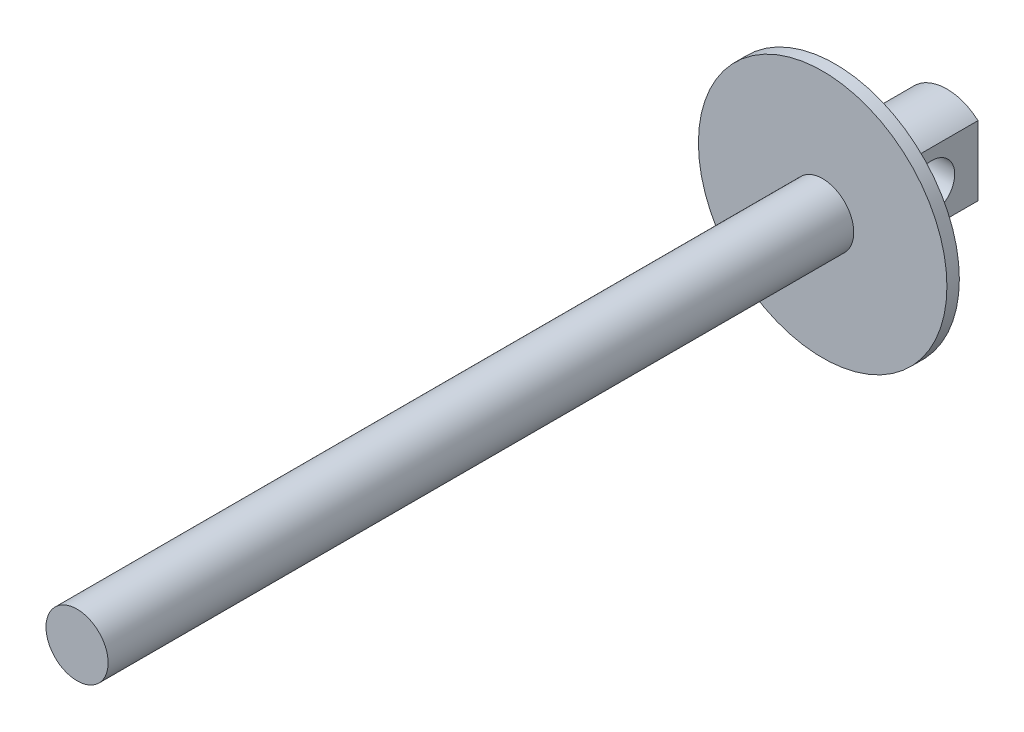
ISO-10303-21;
HEADER;
FILE_DESCRIPTION(('STEP AP214'),'2;1');
FILE_NAME('part.step','',(''),(''),'','','');
FILE_SCHEMA(('AUTOMOTIVE_DESIGN { 1 0 10303 214 1 1 1 1 }'));
ENDSEC;
DATA;
#1=APPLICATION_CONTEXT('core data for automotive mechanical design processes');
#2=APPLICATION_PROTOCOL_DEFINITION('international standard','automotive_design',2000,#1);
#3=PRODUCT_CONTEXT('',#1,'mechanical');
#4=PRODUCT('Part','Part','',(#3));
#5=PRODUCT_RELATED_PRODUCT_CATEGORY('part','',(#4));
#6=PRODUCT_DEFINITION_FORMATION('','',#4);
#7=PRODUCT_DEFINITION_CONTEXT('part definition',#1,'design');
#8=PRODUCT_DEFINITION('design','',#6,#7);
#9=PRODUCT_DEFINITION_SHAPE('','',#8);
#10=(LENGTH_UNIT() NAMED_UNIT(*) SI_UNIT(.MILLI.,.METRE.));
#11=(NAMED_UNIT(*) PLANE_ANGLE_UNIT() SI_UNIT($,.RADIAN.));
#12=(NAMED_UNIT(*) SI_UNIT($,.STERADIAN.) SOLID_ANGLE_UNIT());
#13=UNCERTAINTY_MEASURE_WITH_UNIT(LENGTH_MEASURE(1.E-05),#10,'distance_accuracy_value','');
#14=(GEOMETRIC_REPRESENTATION_CONTEXT(3) GLOBAL_UNCERTAINTY_ASSIGNED_CONTEXT((#13)) GLOBAL_UNIT_ASSIGNED_CONTEXT((#10,
#11,#12)) REPRESENTATION_CONTEXT('',''));
#15=CARTESIAN_POINT('',(0.,0.,0.));
#16=DIRECTION('',(0.,0.,1.));
#17=DIRECTION('',(1.,0.,0.));
#18=AXIS2_PLACEMENT_3D('',#15,#16,#17);
#19=CARTESIAN_POINT('',(0.,0.,2.54));
#20=DIRECTION('',(0.,0.,-1.));
#21=DIRECTION('',(-1.,0.,0.));
#22=AXIS2_PLACEMENT_3D('',#19,#20,#21);
#23=CYLINDRICAL_SURFACE('',#22,25.4);
#24=CARTESIAN_POINT('',(0.,0.,2.54));
#25=DIRECTION('',(0.,0.,1.));
#26=DIRECTION('',(1.,0.,0.));
#27=AXIS2_PLACEMENT_3D('',#24,#25,#26);
#28=CIRCLE('',#27,25.4);
#29=CARTESIAN_POINT('',(25.4,0.,2.54));
#30=VERTEX_POINT('',#29);
#31=EDGE_CURVE('E113',#30,#30,#28,.T.);
#32=ORIENTED_EDGE('',*,*,#31,.F.);
#33=EDGE_LOOP('',(#32));
#34=FACE_BOUND('',#33,.T.);
#35=CARTESIAN_POINT('',(0.,0.,0.));
#36=DIRECTION('',(0.,0.,1.));
#37=DIRECTION('',(1.,0.,0.));
#38=AXIS2_PLACEMENT_3D('',#35,#36,#37);
#39=CIRCLE('',#38,25.4);
#40=CARTESIAN_POINT('',(25.4,0.,0.));
#41=VERTEX_POINT('',#40);
#42=EDGE_CURVE('E110',#41,#41,#39,.T.);
#43=ORIENTED_EDGE('',*,*,#42,.T.);
#44=EDGE_LOOP('',(#43));
#45=FACE_BOUND('',#44,.T.);
#46=ADVANCED_FACE('F37',(#34,#45),#23,.T.);
#47=CARTESIAN_POINT('',(0.,0.,2.54));
#48=DIRECTION('',(0.,0.,1.));
#49=DIRECTION('',(1.,0.,0.));
#50=AXIS2_PLACEMENT_3D('',#47,#48,#49);
#51=PLANE('',#50);
#52=CARTESIAN_POINT('',(0.,0.,2.54));
#53=DIRECTION('',(0.,0.,1.));
#54=DIRECTION('',(1.,0.,0.));
#55=AXIS2_PLACEMENT_3D('',#52,#53,#54);
#56=CIRCLE('',#55,6.35);
#57=CARTESIAN_POINT('',(-6.35,0.,2.53999999999999));
#58=VERTEX_POINT('',#57);
#59=EDGE_CURVE('E107',#58,#58,#56,.T.);
#60=ORIENTED_EDGE('',*,*,#59,.F.);
#61=EDGE_LOOP('',(#60));
#62=FACE_BOUND('',#61,.T.);
#63=ORIENTED_EDGE('',*,*,#31,.T.);
#64=EDGE_LOOP('',(#63));
#65=FACE_BOUND('',#64,.T.);
#66=ADVANCED_FACE('F145',(#62,#65),#51,.T.);
#67=CARTESIAN_POINT('',(0.,0.,0.));
#68=DIRECTION('',(0.,0.,1.));
#69=DIRECTION('',(1.,0.,0.));
#70=AXIS2_PLACEMENT_3D('',#67,#68,#69);
#71=PLANE('',#70);
#72=CARTESIAN_POINT('',(0.,0.,0.));
#73=DIRECTION('',(0.,0.,-1.));
#74=DIRECTION('',(-1.,0.,0.));
#75=AXIS2_PLACEMENT_3D('',#72,#73,#74);
#76=CIRCLE('',#75,9.525);
#77=CARTESIAN_POINT('',(-9.525,0.,0.));
#78=VERTEX_POINT('',#77);
#79=EDGE_CURVE('E87',#78,#78,#76,.T.);
#80=ORIENTED_EDGE('',*,*,#79,.F.);
#81=EDGE_LOOP('',(#80));
#82=FACE_BOUND('',#81,.T.);
#83=ORIENTED_EDGE('',*,*,#42,.F.);
#84=EDGE_LOOP('',(#83));
#85=FACE_BOUND('',#84,.T.);
#86=ADVANCED_FACE('F150',(#82,#85),#71,.F.);
#87=CARTESIAN_POINT('',(0.,0.,154.94));
#88=DIRECTION('',(0.,0.,-1.));
#89=DIRECTION('',(-1.,0.,0.));
#90=AXIS2_PLACEMENT_3D('',#87,#88,#89);
#91=CYLINDRICAL_SURFACE('',#90,6.35);
#92=CARTESIAN_POINT('',(0.,0.,154.94));
#93=DIRECTION('',(0.,0.,1.));
#94=DIRECTION('',(1.,0.,0.));
#95=AXIS2_PLACEMENT_3D('',#92,#93,#94);
#96=CIRCLE('',#95,6.35);
#97=CARTESIAN_POINT('',(-6.35,0.,154.94));
#98=VERTEX_POINT('',#97);
#99=EDGE_CURVE('E100',#98,#98,#96,.T.);
#100=CARTESIAN_POINT('',(-6.35,0.,154.94));
#101=CARTESIAN_POINT('',(-6.35,0.,153.3525));
#102=CARTESIAN_POINT('',(-6.35,0.,151.765));
#103=CARTESIAN_POINT('',(-6.35,0.,148.59));
#104=CARTESIAN_POINT('',(-6.35,0.,147.0025));
#105=CARTESIAN_POINT('',(-6.35,0.,143.8275));
#106=CARTESIAN_POINT('',(-6.35,0.,142.24));
#107=CARTESIAN_POINT('',(-6.35,0.,139.065));
#108=CARTESIAN_POINT('',(-6.35,0.,137.4775));
#109=CARTESIAN_POINT('',(-6.35,0.,134.3025));
#110=CARTESIAN_POINT('',(-6.35,0.,132.715));
#111=CARTESIAN_POINT('',(-6.35,0.,129.54));
#112=CARTESIAN_POINT('',(-6.35,0.,127.9525));
#113=CARTESIAN_POINT('',(-6.35,0.,124.7775));
#114=CARTESIAN_POINT('',(-6.35,0.,123.19));
#115=CARTESIAN_POINT('',(-6.35,0.,120.015));
#116=CARTESIAN_POINT('',(-6.35,0.,118.4275));
#117=CARTESIAN_POINT('',(-6.35,0.,115.2525));
#118=CARTESIAN_POINT('',(-6.35,0.,113.665));
#119=CARTESIAN_POINT('',(-6.35,0.,110.49));
#120=CARTESIAN_POINT('',(-6.35,0.,108.9025));
#121=CARTESIAN_POINT('',(-6.35,0.,105.7275));
#122=CARTESIAN_POINT('',(-6.35,0.,104.14));
#123=CARTESIAN_POINT('',(-6.35,0.,100.965));
#124=CARTESIAN_POINT('',(-6.35,0.,99.3775));
#125=CARTESIAN_POINT('',(-6.35,0.,96.2025));
#126=CARTESIAN_POINT('',(-6.35,0.,94.615));
#127=CARTESIAN_POINT('',(-6.35,0.,91.44));
#128=CARTESIAN_POINT('',(-6.35,0.,89.8525));
#129=CARTESIAN_POINT('',(-6.35,0.,86.6775));
#130=CARTESIAN_POINT('',(-6.35,0.,85.09));
#131=CARTESIAN_POINT('',(-6.35,0.,81.915));
#132=CARTESIAN_POINT('',(-6.35,0.,80.3275));
#133=CARTESIAN_POINT('',(-6.35,0.,77.1525));
#134=CARTESIAN_POINT('',(-6.35,0.,75.565));
#135=CARTESIAN_POINT('',(-6.35,0.,72.39));
#136=CARTESIAN_POINT('',(-6.35,0.,70.8025));
#137=CARTESIAN_POINT('',(-6.35,0.,67.6275));
#138=CARTESIAN_POINT('',(-6.35,0.,66.04));
#139=CARTESIAN_POINT('',(-6.35,0.,62.865));
#140=CARTESIAN_POINT('',(-6.35,0.,61.2775));
#141=CARTESIAN_POINT('',(-6.35,0.,58.1025));
#142=CARTESIAN_POINT('',(-6.35,0.,56.515));
#143=CARTESIAN_POINT('',(-6.35,0.,53.34));
#144=CARTESIAN_POINT('',(-6.35,0.,51.7525));
#145=CARTESIAN_POINT('',(-6.35,0.,48.5775));
#146=CARTESIAN_POINT('',(-6.35,0.,46.99));
#147=CARTESIAN_POINT('',(-6.35,0.,43.815));
#148=CARTESIAN_POINT('',(-6.35,0.,42.2275));
#149=CARTESIAN_POINT('',(-6.35,0.,39.0525));
#150=CARTESIAN_POINT('',(-6.35,0.,37.465));
#151=CARTESIAN_POINT('',(-6.35,0.,34.29));
#152=CARTESIAN_POINT('',(-6.35,0.,32.7025));
#153=CARTESIAN_POINT('',(-6.35,0.,29.5275));
#154=CARTESIAN_POINT('',(-6.35,0.,27.94));
#155=CARTESIAN_POINT('',(-6.35,0.,24.765));
#156=CARTESIAN_POINT('',(-6.35,0.,23.1775));
#157=CARTESIAN_POINT('',(-6.35,0.,20.0025));
#158=CARTESIAN_POINT('',(-6.35,0.,18.415));
#159=CARTESIAN_POINT('',(-6.35,0.,15.24));
#160=CARTESIAN_POINT('',(-6.35,0.,13.6525));
#161=CARTESIAN_POINT('',(-6.35,0.,10.4775));
#162=CARTESIAN_POINT('',(-6.35,0.,8.88999999999999));
#163=CARTESIAN_POINT('',(-6.35,0.,5.71499999999999));
#164=CARTESIAN_POINT('',(-6.35,0.,4.12749999999999));
#165=CARTESIAN_POINT('',(-6.35,0.,2.53999999999999));
#166=B_SPLINE_CURVE_WITH_KNOTS('',3,(#100,#101,#102,#103,#104,#105,#106,#107,#108,#109,#110,
#111,#112,#113,#114,#115,#116,#117,#118,#119,#120,#121,#122,#123,#124,#125,#126,#127,#128,#129,
#130,#131,#132,#133,#134,#135,#136,#137,#138,#139,#140,#141,#142,#143,#144,#145,#146,#147,#148,
#149,#150,#151,#152,#153,#154,#155,#156,#157,#158,#159,#160,#161,#162,#163,#164,#165),
.UNSPECIFIED.,.F.,.F.,(4,2,2,2,2,2,2,2,2,2,2,2,2,2,2,2,2,2,2,2,2,2,2,2,2,2,2,2,2,2,2,2,4),(0.,
4.7625,9.52500000000001,14.2875,19.05,23.8125,28.575,33.3375,38.1,42.8625,47.625,52.3875,57.15,
61.9125,66.675,71.4375,76.2,80.9625,85.725,90.4875,95.25,100.0125,104.775,109.5375,114.3,
119.0625,123.825,128.5875,133.35,138.1125,142.875,147.6375,152.4),.UNSPECIFIED.);
#167=EDGE_CURVE('BSEAM158',#98,#58,#166,.T.);
#168=ORIENTED_EDGE('',*,*,#99,.F.);
#169=ORIENTED_EDGE('',*,*,#59,.T.);
#170=ORIENTED_EDGE('',*,*,#167,.T.);
#171=ORIENTED_EDGE('',*,*,#167,.F.);
#172=EDGE_LOOP('',(#168,#170,#169,#171));
#173=FACE_BOUND('',#172,.T.);
#174=ADVANCED_FACE('F158',(#173),#91,.T.);
#175=CARTESIAN_POINT('',(0.,0.,154.94));
#176=DIRECTION('',(0.,0.,1.));
#177=DIRECTION('',(1.,0.,0.));
#178=AXIS2_PLACEMENT_3D('',#175,#176,#177);
#179=PLANE('',#178);
#180=ORIENTED_EDGE('',*,*,#99,.T.);
#181=EDGE_LOOP('',(#180));
#182=FACE_BOUND('',#181,.T.);
#183=ADVANCED_FACE('F163',(#182),#179,.T.);
#184=CARTESIAN_POINT('',(0.,0.,-22.86));
#185=DIRECTION('',(0.,0.,1.));
#186=DIRECTION('',(1.,0.,0.));
#187=AXIS2_PLACEMENT_3D('',#184,#185,#186);
#188=CYLINDRICAL_SURFACE('',#187,9.525);
#189=DIRECTION('',(0.,0.,1.));
#190=VECTOR('',#189,1.);
#191=CARTESIAN_POINT('',(6.35,-7.09951582856183,-22.86));
#192=LINE('',#191,#190);
#193=CARTESIAN_POINT('',(6.35,-7.09951582856183,-22.86));
#194=VERTEX_POINT('',#193);
#195=CARTESIAN_POINT('',(6.35,-7.09951582856184,-3.81));
#196=VERTEX_POINT('',#195);
#197=EDGE_CURVE('E52',#194,#196,#192,.T.);
#198=ORIENTED_EDGE('',*,*,#197,.T.);
#199=CARTESIAN_POINT('',(0.,0.,-3.81));
#200=DIRECTION('',(0.,0.,1.));
#201=DIRECTION('',(1.,0.,0.));
#202=AXIS2_PLACEMENT_3D('',#199,#200,#201);
#203=CIRCLE('',#202,9.525);
#204=CARTESIAN_POINT('',(6.35,7.09951582856181,-3.81));
#205=VERTEX_POINT('',#204);
#206=EDGE_CURVE('E11',#196,#205,#203,.T.);
#207=ORIENTED_EDGE('',*,*,#206,.T.);
#208=DIRECTION('',(0.,0.,1.));
#209=VECTOR('',#208,1.);
#210=CARTESIAN_POINT('',(6.35,7.09951582856183,-22.86));
#211=LINE('',#210,#209);
#212=CARTESIAN_POINT('',(6.35,7.09951582856181,-22.86));
#213=VERTEX_POINT('',#212);
#214=EDGE_CURVE('E101',#205,#213,#211,.F.);
#215=ORIENTED_EDGE('',*,*,#214,.T.);
#216=CARTESIAN_POINT('',(0.,0.,-22.86));
#217=DIRECTION('',(0.,0.,-1.));
#218=DIRECTION('',(-1.,0.,0.));
#219=AXIS2_PLACEMENT_3D('',#216,#217,#218);
#220=CIRCLE('',#219,9.525);
#221=CARTESIAN_POINT('',(-6.35,7.09951582856184,-22.86));
#222=VERTEX_POINT('',#221);
#223=EDGE_CURVE('E98',#222,#213,#220,.T.);
#224=ORIENTED_EDGE('',*,*,#223,.F.);
#225=DIRECTION('',(0.,0.,1.));
#226=VECTOR('',#225,1.);
#227=CARTESIAN_POINT('',(-6.35,7.09951582856184,-22.86));
#228=LINE('',#227,#226);
#229=CARTESIAN_POINT('',(-6.34999999999999,7.09951582856184,-3.81));
#230=VERTEX_POINT('',#229);
#231=EDGE_CURVE('E60',#222,#230,#228,.T.);
#232=ORIENTED_EDGE('',*,*,#231,.T.);
#233=CARTESIAN_POINT('',(0.,0.,-3.81));
#234=DIRECTION('',(0.,0.,1.));
#235=DIRECTION('',(1.,0.,0.));
#236=AXIS2_PLACEMENT_3D('',#233,#234,#235);
#237=CIRCLE('',#236,9.525);
#238=CARTESIAN_POINT('',(-6.34999999999999,-7.09951582856184,-3.81));
#239=VERTEX_POINT('',#238);
#240=EDGE_CURVE('E45',#230,#239,#237,.T.);
#241=ORIENTED_EDGE('',*,*,#240,.T.);
#242=DIRECTION('',(0.,0.,1.));
#243=VECTOR('',#242,1.);
#244=CARTESIAN_POINT('',(-6.35,-7.09951582856184,-22.86));
#245=LINE('',#244,#243);
#246=CARTESIAN_POINT('',(-6.35,-7.09951582856184,-22.86));
#247=VERTEX_POINT('',#246);
#248=EDGE_CURVE('E80',#239,#247,#245,.F.);
#249=ORIENTED_EDGE('',*,*,#248,.T.);
#250=EDGE_CURVE('E94',#194,#247,#220,.T.);
#251=ORIENTED_EDGE('',*,*,#250,.F.);
#252=EDGE_LOOP('',(#198,#207,#215,#224,#232,#241,#249,#251));
#253=FACE_BOUND('',#252,.T.);
#254=ORIENTED_EDGE('',*,*,#79,.T.);
#255=EDGE_LOOP('',(#254));
#256=FACE_BOUND('',#255,.T.);
#257=ADVANCED_FACE('F92',(#253,#256),#188,.T.);
#258=CARTESIAN_POINT('',(0.,0.,-22.86));
#259=DIRECTION('',(0.,0.,-1.));
#260=DIRECTION('',(-1.,0.,0.));
#261=AXIS2_PLACEMENT_3D('',#258,#259,#260);
#262=PLANE('',#261);
#263=DIRECTION('',(0.,1.,0.));
#264=VECTOR('',#263,1.);
#265=CARTESIAN_POINT('',(6.35,0.,-22.86));
#266=LINE('',#265,#264);
#267=EDGE_CURVE('E86',#194,#213,#266,.T.);
#268=ORIENTED_EDGE('',*,*,#267,.F.);
#269=ORIENTED_EDGE('',*,*,#250,.T.);
#270=DIRECTION('',(0.,-1.,0.));
#271=VECTOR('',#270,1.);
#272=CARTESIAN_POINT('',(-6.35,0.,-22.86));
#273=LINE('',#272,#271);
#274=EDGE_CURVE('E77',#222,#247,#273,.T.);
#275=ORIENTED_EDGE('',*,*,#274,.F.);
#276=ORIENTED_EDGE('',*,*,#223,.T.);
#277=EDGE_LOOP('',(#268,#269,#275,#276));
#278=FACE_BOUND('',#277,.T.);
#279=ADVANCED_FACE('F97',(#278),#262,.T.);
#280=CARTESIAN_POINT('',(-9.525,-25.4,-3.81));
#281=DIRECTION('',(0.,0.,1.));
#282=DIRECTION('',(1.,0.,0.));
#283=AXIS2_PLACEMENT_3D('',#280,#281,#282);
#284=PLANE('',#283);
#285=DIRECTION('',(0.,1.,0.));
#286=VECTOR('',#285,1.);
#287=CARTESIAN_POINT('',(-6.35,-25.4,-3.81));
#288=LINE('',#287,#286);
#289=EDGE_CURVE('E124',#239,#230,#288,.T.);
#290=ORIENTED_EDGE('',*,*,#289,.F.);
#291=ORIENTED_EDGE('',*,*,#240,.F.);
#292=EDGE_LOOP('',(#290,#291));
#293=FACE_BOUND('',#292,.T.);
#294=ADVANCED_FACE('F175',(#293),#284,.F.);
#295=CARTESIAN_POINT('',(-6.35,-25.4,-22.86));
#296=DIRECTION('',(1.,0.,0.));
#297=DIRECTION('',(0.,0.,-1.));
#298=AXIS2_PLACEMENT_3D('',#295,#296,#297);
#299=PLANE('',#298);
#300=CARTESIAN_POINT('',(-6.35,0.,-13.335));
#301=DIRECTION('',(-1.,0.,0.));
#302=DIRECTION('',(0.,0.,1.));
#303=AXIS2_PLACEMENT_3D('',#300,#301,#302);
#304=CIRCLE('',#303,4.7625);
#305=CARTESIAN_POINT('',(-6.35,0.,-8.57249999999999));
#306=VERTEX_POINT('',#305);
#307=EDGE_CURVE('E127',#306,#306,#304,.T.);
#308=ORIENTED_EDGE('',*,*,#307,.F.);
#309=EDGE_LOOP('',(#308));
#310=FACE_BOUND('',#309,.T.);
#311=ORIENTED_EDGE('',*,*,#274,.T.);
#312=ORIENTED_EDGE('',*,*,#248,.F.);
#313=ORIENTED_EDGE('',*,*,#289,.T.);
#314=ORIENTED_EDGE('',*,*,#231,.F.);
#315=EDGE_LOOP('',(#311,#312,#313,#314));
#316=FACE_BOUND('',#315,.T.);
#317=ADVANCED_FACE('F79',(#310,#316),#299,.F.);
#318=CARTESIAN_POINT('',(9.525,-25.4,-3.81));
#319=DIRECTION('',(0.,0.,1.));
#320=DIRECTION('',(1.,0.,0.));
#321=AXIS2_PLACEMENT_3D('',#318,#319,#320);
#322=PLANE('',#321);
#323=ORIENTED_EDGE('',*,*,#206,.F.);
#324=DIRECTION('',(0.,1.,0.));
#325=VECTOR('',#324,1.);
#326=CARTESIAN_POINT('',(6.35,-25.4,-3.81));
#327=LINE('',#326,#325);
#328=EDGE_CURVE('E95',#196,#205,#327,.T.);
#329=ORIENTED_EDGE('',*,*,#328,.T.);
#330=EDGE_LOOP('',(#323,#329));
#331=FACE_BOUND('',#330,.T.);
#332=ADVANCED_FACE('F141',(#331),#322,.F.);
#333=CARTESIAN_POINT('',(6.35,-25.4,-22.86));
#334=DIRECTION('',(-1.,0.,0.));
#335=DIRECTION('',(0.,0.,1.));
#336=AXIS2_PLACEMENT_3D('',#333,#334,#335);
#337=PLANE('',#336);
#338=CARTESIAN_POINT('',(6.35,0.,-13.335));
#339=DIRECTION('',(-1.,0.,0.));
#340=DIRECTION('',(0.,0.,1.));
#341=AXIS2_PLACEMENT_3D('',#338,#339,#340);
#342=CIRCLE('',#341,4.7625);
#343=CARTESIAN_POINT('',(6.35,0.,-8.57249999999999));
#344=VERTEX_POINT('',#343);
#345=EDGE_CURVE('E40',#344,#344,#342,.T.);
#346=ORIENTED_EDGE('',*,*,#345,.T.);
#347=EDGE_LOOP('',(#346));
#348=FACE_BOUND('',#347,.T.);
#349=ORIENTED_EDGE('',*,*,#267,.T.);
#350=ORIENTED_EDGE('',*,*,#214,.F.);
#351=ORIENTED_EDGE('',*,*,#328,.F.);
#352=ORIENTED_EDGE('',*,*,#197,.F.);
#353=EDGE_LOOP('',(#349,#350,#351,#352));
#354=FACE_BOUND('',#353,.T.);
#355=ADVANCED_FACE('F120',(#348,#354),#337,.F.);
#356=CARTESIAN_POINT('',(25.4,0.,-13.335));
#357=DIRECTION('',(-1.,0.,0.));
#358=DIRECTION('',(0.,0.,1.));
#359=AXIS2_PLACEMENT_3D('',#356,#357,#358);
#360=CYLINDRICAL_SURFACE('',#359,4.7625);
#361=ORIENTED_EDGE('',*,*,#307,.T.);
#362=EDGE_LOOP('',(#361));
#363=FACE_BOUND('',#362,.T.);
#364=ORIENTED_EDGE('',*,*,#345,.F.);
#365=EDGE_LOOP('',(#364));
#366=FACE_BOUND('',#365,.T.);
#367=ADVANCED_FACE('F135',(#363,#366),#360,.F.);
#368=CLOSED_SHELL('',(#46,#66,#86,#174,#183,#257,#279,#294,#317,#332,#355,#367));
#369=MANIFOLD_SOLID_BREP('B2',#368);
#370=ADVANCED_BREP_SHAPE_REPRESENTATION('',(#18,#369),#14);
#371=SHAPE_DEFINITION_REPRESENTATION(#9,#370);
ENDSEC;
END-ISO-10303-21;
